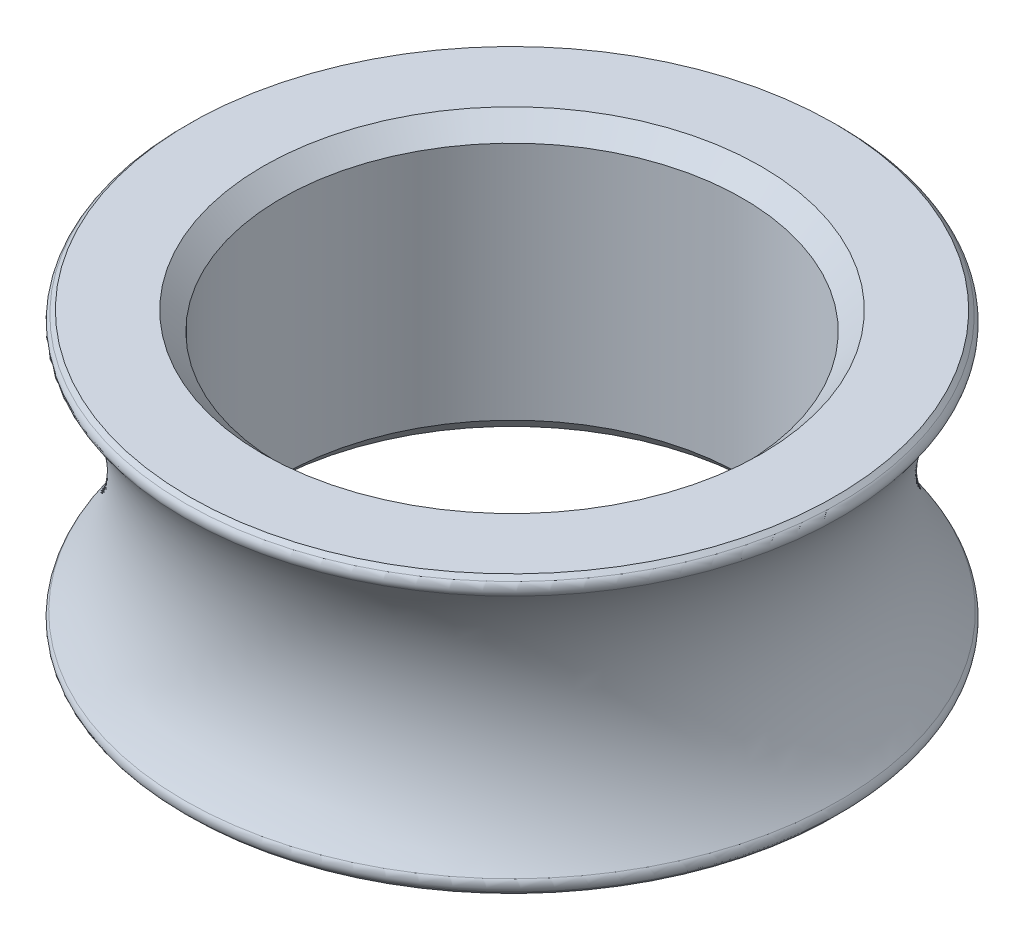
ISO-10303-21;
HEADER;
FILE_DESCRIPTION(('STEP AP214'),'2;1');
FILE_NAME('part.step','',(''),(''),'','','');
FILE_SCHEMA(('AUTOMOTIVE_DESIGN { 1 0 10303 214 1 1 1 1 }'));
ENDSEC;
DATA;
#1=APPLICATION_CONTEXT('core data for automotive mechanical design processes');
#2=APPLICATION_PROTOCOL_DEFINITION('international standard','automotive_design',2000,#1);
#3=PRODUCT_CONTEXT('',#1,'mechanical');
#4=PRODUCT('Part','Part','',(#3));
#5=PRODUCT_RELATED_PRODUCT_CATEGORY('part','',(#4));
#6=PRODUCT_DEFINITION_FORMATION('','',#4);
#7=PRODUCT_DEFINITION_CONTEXT('part definition',#1,'design');
#8=PRODUCT_DEFINITION('design','',#6,#7);
#9=PRODUCT_DEFINITION_SHAPE('','',#8);
#10=(LENGTH_UNIT() NAMED_UNIT(*) SI_UNIT(.MILLI.,.METRE.));
#11=(NAMED_UNIT(*) PLANE_ANGLE_UNIT() SI_UNIT($,.RADIAN.));
#12=(NAMED_UNIT(*) SI_UNIT($,.STERADIAN.) SOLID_ANGLE_UNIT());
#13=UNCERTAINTY_MEASURE_WITH_UNIT(LENGTH_MEASURE(1.E-05),#10,'distance_accuracy_value','');
#14=(GEOMETRIC_REPRESENTATION_CONTEXT(3) GLOBAL_UNCERTAINTY_ASSIGNED_CONTEXT((#13)) GLOBAL_UNIT_ASSIGNED_CONTEXT((#10,
#11,#12)) REPRESENTATION_CONTEXT('',''));
#15=CARTESIAN_POINT('',(0.,0.,0.));
#16=DIRECTION('',(0.,0.,1.));
#17=DIRECTION('',(1.,0.,0.));
#18=AXIS2_PLACEMENT_3D('',#15,#16,#17);
#19=CARTESIAN_POINT('',(0.,1.5,0.));
#20=DIRECTION('',(0.,1.,0.));
#21=DIRECTION('',(0.,0.,1.));
#22=AXIS2_PLACEMENT_3D('',#19,#20,#21);
#23=PLANE('',#22);
#24=CARTESIAN_POINT('',(0.,1.5,0.));
#25=DIRECTION('',(0.,1.,0.));
#26=DIRECTION('',(0.,0.,1.));
#27=AXIS2_PLACEMENT_3D('',#24,#25,#26);
#28=CIRCLE('',#27,3.5);
#29=CARTESIAN_POINT('',(0.,1.5,3.5));
#30=VERTEX_POINT('',#29);
#31=EDGE_CURVE('E85',#30,#30,#28,.T.);
#32=ORIENTED_EDGE('',*,*,#31,.T.);
#33=EDGE_LOOP('',(#32));
#34=FACE_BOUND('',#33,.T.);
#35=CARTESIAN_POINT('',(0.,1.5,0.));
#36=DIRECTION('',(0.,1.,0.));
#37=DIRECTION('',(0.,0.,1.));
#38=AXIS2_PLACEMENT_3D('',#35,#36,#37);
#39=CIRCLE('',#38,2.7);
#40=CARTESIAN_POINT('',(0.,1.5,2.7));
#41=VERTEX_POINT('',#40);
#42=EDGE_CURVE('E83',#41,#41,#39,.F.);
#43=ORIENTED_EDGE('',*,*,#42,.T.);
#44=EDGE_LOOP('',(#43));
#45=FACE_BOUND('',#44,.T.);
#46=ADVANCED_FACE('F35',(#34,#45),#23,.T.);
#47=CARTESIAN_POINT('',(0.,-1.5,0.));
#48=DIRECTION('',(0.,1.,0.));
#49=DIRECTION('',(0.,0.,1.));
#50=AXIS2_PLACEMENT_3D('',#47,#48,#49);
#51=PLANE('',#50);
#52=CARTESIAN_POINT('',(0.,-1.5,0.));
#53=DIRECTION('',(0.,1.,0.));
#54=DIRECTION('',(0.,0.,1.));
#55=AXIS2_PLACEMENT_3D('',#52,#53,#54);
#56=CIRCLE('',#55,2.7);
#57=CARTESIAN_POINT('',(0.,-1.5,2.7));
#58=VERTEX_POINT('',#57);
#59=EDGE_CURVE('E94',#58,#58,#56,.T.);
#60=ORIENTED_EDGE('',*,*,#59,.T.);
#61=EDGE_LOOP('',(#60));
#62=FACE_BOUND('',#61,.T.);
#63=CARTESIAN_POINT('',(0.,-1.5,0.));
#64=DIRECTION('',(0.,1.,0.));
#65=DIRECTION('',(0.,0.,1.));
#66=AXIS2_PLACEMENT_3D('',#63,#64,#65);
#67=CIRCLE('',#66,3.5);
#68=CARTESIAN_POINT('',(0.,-1.5,3.5));
#69=VERTEX_POINT('',#68);
#70=EDGE_CURVE('E74',#69,#69,#67,.F.);
#71=ORIENTED_EDGE('',*,*,#70,.T.);
#72=EDGE_LOOP('',(#71));
#73=FACE_BOUND('',#72,.T.);
#74=ADVANCED_FACE('F117',(#62,#73),#51,.F.);
#75=CARTESIAN_POINT('',(0.,1.5,0.));
#76=DIRECTION('',(0.,-1.,0.));
#77=DIRECTION('',(0.,0.,-1.));
#78=AXIS2_PLACEMENT_3D('',#75,#76,#77);
#79=CYLINDRICAL_SURFACE('',#78,2.5);
#80=CARTESIAN_POINT('',(0.,-1.3,0.));
#81=DIRECTION('',(0.,1.,0.));
#82=DIRECTION('',(0.,0.,1.));
#83=AXIS2_PLACEMENT_3D('',#80,#81,#82);
#84=CIRCLE('',#83,2.5);
#85=CARTESIAN_POINT('',(0.,-1.3,2.5));
#86=VERTEX_POINT('',#85);
#87=EDGE_CURVE('E99',#86,#86,#84,.F.);
#88=ORIENTED_EDGE('',*,*,#87,.T.);
#89=EDGE_LOOP('',(#88));
#90=FACE_BOUND('',#89,.T.);
#91=CARTESIAN_POINT('',(0.,1.3,0.));
#92=DIRECTION('',(0.,1.,0.));
#93=DIRECTION('',(0.,0.,1.));
#94=AXIS2_PLACEMENT_3D('',#91,#92,#93);
#95=CIRCLE('',#94,2.5);
#96=CARTESIAN_POINT('',(0.,1.3,2.5));
#97=VERTEX_POINT('',#96);
#98=EDGE_CURVE('E97',#97,#97,#95,.T.);
#99=ORIENTED_EDGE('',*,*,#98,.T.);
#100=EDGE_LOOP('',(#99));
#101=FACE_BOUND('',#100,.T.);
#102=ADVANCED_FACE('F114',(#90,#101),#79,.F.);
#103=CARTESIAN_POINT('',(0.,0.,0.));
#104=DIRECTION('',(0.,1.,0.));
#105=DIRECTION('',(0.,0.,1.));
#106=AXIS2_PLACEMENT_3D('',#103,#104,#105);
#107=TOROIDAL_SURFACE('',#106,5.275,2.175);
#108=CARTESIAN_POINT('',(0.,0.,5.275));
#109=DIRECTION('',(1.,0.,0.));
#110=DIRECTION('',(0.,0.,1.));
#111=AXIS2_PLACEMENT_3D('',#108,#109,#110);
#112=CIRCLE('',#111,2.175);
#113=CARTESIAN_POINT('',(0.,-1.3259621573394,3.55092072186229));
#114=VERTEX_POINT('',#113);
#115=CARTESIAN_POINT('',(0.,1.3259621573394,3.55092072186229));
#116=VERTEX_POINT('',#115);
#117=EDGE_CURVE('E75',#114,#116,#112,.T.);
#118=ORIENTED_EDGE('',*,*,#117,.T.);
#119=CARTESIAN_POINT('',(0.,1.3259621573394,0.));
#120=DIRECTION('',(0.,-1.,0.));
#121=DIRECTION('',(0.,0.,-1.));
#122=AXIS2_PLACEMENT_3D('',#119,#120,#121);
#123=CIRCLE('',#122,3.55092072186229);
#124=EDGE_CURVE('E203',#116,#116,#123,.T.);
#125=ORIENTED_EDGE('',*,*,#124,.T.);
#126=ORIENTED_EDGE('',*,*,#117,.F.);
#127=CARTESIAN_POINT('',(0.,-1.3259621573394,0.));
#128=DIRECTION('',(0.,1.,0.));
#129=DIRECTION('',(0.,0.,1.));
#130=AXIS2_PLACEMENT_3D('',#127,#128,#129);
#131=CIRCLE('',#130,3.55092072186229);
#132=EDGE_CURVE('E87',#114,#114,#131,.T.);
#133=ORIENTED_EDGE('',*,*,#132,.T.);
#134=EDGE_LOOP('',(#118,#125,#126,#133));
#135=FACE_BOUND('',#134,.T.);
#136=ADVANCED_FACE('F116',(#135),#107,.F.);
#137=CARTESIAN_POINT('',(0.,-1.5,0.));
#138=DIRECTION('',(0.,-1.,0.));
#139=DIRECTION('',(0.,0.,-1.));
#140=AXIS2_PLACEMENT_3D('',#137,#138,#139);
#141=CONICAL_SURFACE('',#140,2.7,0.785398163397447);
#142=ORIENTED_EDGE('',*,*,#87,.F.);
#143=EDGE_LOOP('',(#142));
#144=FACE_BOUND('',#143,.T.);
#145=ORIENTED_EDGE('',*,*,#59,.F.);
#146=EDGE_LOOP('',(#145));
#147=FACE_BOUND('',#146,.T.);
#148=ADVANCED_FACE('F110',(#144,#147),#141,.F.);
#149=CARTESIAN_POINT('',(0.,1.3,0.));
#150=DIRECTION('',(0.,1.,0.));
#151=DIRECTION('',(0.,0.,1.));
#152=AXIS2_PLACEMENT_3D('',#149,#150,#151);
#153=CONICAL_SURFACE('',#152,2.5,0.785398163397448);
#154=CARTESIAN_POINT('',(0.,1.5,2.7));
#155=CARTESIAN_POINT('',(0.,1.49791666666667,2.69791666666667));
#156=CARTESIAN_POINT('',(0.,1.49583333333333,2.69583333333333));
#157=CARTESIAN_POINT('',(0.,1.49166666666667,2.69166666666667));
#158=CARTESIAN_POINT('',(0.,1.48958333333333,2.68958333333333));
#159=CARTESIAN_POINT('',(0.,1.48541666666667,2.68541666666667));
#160=CARTESIAN_POINT('',(0.,1.48333333333333,2.68333333333333));
#161=CARTESIAN_POINT('',(0.,1.47916666666667,2.67916666666667));
#162=CARTESIAN_POINT('',(0.,1.47708333333333,2.67708333333333));
#163=CARTESIAN_POINT('',(0.,1.47291666666667,2.67291666666667));
#164=CARTESIAN_POINT('',(0.,1.47083333333333,2.67083333333333));
#165=CARTESIAN_POINT('',(0.,1.46666666666667,2.66666666666667));
#166=CARTESIAN_POINT('',(0.,1.46458333333333,2.66458333333333));
#167=CARTESIAN_POINT('',(0.,1.46041666666667,2.66041666666667));
#168=CARTESIAN_POINT('',(0.,1.45833333333333,2.65833333333333));
#169=CARTESIAN_POINT('',(0.,1.45416666666667,2.65416666666667));
#170=CARTESIAN_POINT('',(0.,1.45208333333333,2.65208333333333));
#171=CARTESIAN_POINT('',(0.,1.44791666666667,2.64791666666667));
#172=CARTESIAN_POINT('',(0.,1.44583333333333,2.64583333333333));
#173=CARTESIAN_POINT('',(0.,1.44166666666667,2.64166666666667));
#174=CARTESIAN_POINT('',(0.,1.43958333333333,2.63958333333333));
#175=CARTESIAN_POINT('',(0.,1.43541666666667,2.63541666666667));
#176=CARTESIAN_POINT('',(0.,1.43333333333333,2.63333333333333));
#177=CARTESIAN_POINT('',(0.,1.42916666666667,2.62916666666667));
#178=CARTESIAN_POINT('',(0.,1.42708333333333,2.62708333333333));
#179=CARTESIAN_POINT('',(0.,1.42291666666667,2.62291666666667));
#180=CARTESIAN_POINT('',(0.,1.42083333333333,2.62083333333333));
#181=CARTESIAN_POINT('',(0.,1.41666666666667,2.61666666666667));
#182=CARTESIAN_POINT('',(0.,1.41458333333333,2.61458333333333));
#183=CARTESIAN_POINT('',(0.,1.41041666666667,2.61041666666667));
#184=CARTESIAN_POINT('',(0.,1.40833333333333,2.60833333333333));
#185=CARTESIAN_POINT('',(0.,1.40416666666667,2.60416666666667));
#186=CARTESIAN_POINT('',(0.,1.40208333333333,2.60208333333333));
#187=CARTESIAN_POINT('',(0.,1.39791666666667,2.59791666666667));
#188=CARTESIAN_POINT('',(0.,1.39583333333333,2.59583333333333));
#189=CARTESIAN_POINT('',(0.,1.39166666666667,2.59166666666667));
#190=CARTESIAN_POINT('',(0.,1.38958333333333,2.58958333333333));
#191=CARTESIAN_POINT('',(0.,1.38541666666667,2.58541666666667));
#192=CARTESIAN_POINT('',(0.,1.38333333333333,2.58333333333333));
#193=CARTESIAN_POINT('',(0.,1.37916666666667,2.57916666666667));
#194=CARTESIAN_POINT('',(0.,1.37708333333333,2.57708333333333));
#195=CARTESIAN_POINT('',(0.,1.37291666666667,2.57291666666667));
#196=CARTESIAN_POINT('',(0.,1.37083333333333,2.57083333333333));
#197=CARTESIAN_POINT('',(0.,1.36666666666667,2.56666666666667));
#198=CARTESIAN_POINT('',(0.,1.36458333333333,2.56458333333333));
#199=CARTESIAN_POINT('',(0.,1.36041666666667,2.56041666666667));
#200=CARTESIAN_POINT('',(0.,1.35833333333333,2.55833333333333));
#201=CARTESIAN_POINT('',(0.,1.35416666666667,2.55416666666667));
#202=CARTESIAN_POINT('',(0.,1.35208333333333,2.55208333333333));
#203=CARTESIAN_POINT('',(0.,1.34791666666667,2.54791666666667));
#204=CARTESIAN_POINT('',(0.,1.34583333333333,2.54583333333333));
#205=CARTESIAN_POINT('',(0.,1.34166666666667,2.54166666666667));
#206=CARTESIAN_POINT('',(0.,1.33958333333333,2.53958333333333));
#207=CARTESIAN_POINT('',(0.,1.33541666666667,2.53541666666667));
#208=CARTESIAN_POINT('',(0.,1.33333333333333,2.53333333333333));
#209=CARTESIAN_POINT('',(0.,1.32916666666667,2.52916666666667));
#210=CARTESIAN_POINT('',(0.,1.32708333333333,2.52708333333333));
#211=CARTESIAN_POINT('',(0.,1.32291666666667,2.52291666666667));
#212=CARTESIAN_POINT('',(0.,1.32083333333333,2.52083333333333));
#213=CARTESIAN_POINT('',(0.,1.31666666666667,2.51666666666667));
#214=CARTESIAN_POINT('',(0.,1.31458333333333,2.51458333333333));
#215=CARTESIAN_POINT('',(0.,1.31041666666667,2.51041666666667));
#216=CARTESIAN_POINT('',(0.,1.30833333333333,2.50833333333333));
#217=CARTESIAN_POINT('',(0.,1.30416666666667,2.50416666666667));
#218=CARTESIAN_POINT('',(0.,1.30208333333333,2.50208333333333));
#219=CARTESIAN_POINT('',(0.,1.3,2.5));
#220=B_SPLINE_CURVE_WITH_KNOTS('',3,(#154,#155,#156,#157,#158,#159,#160,#161,#162,#163,#164,
#165,#166,#167,#168,#169,#170,#171,#172,#173,#174,#175,#176,#177,#178,#179,#180,#181,#182,#183,
#184,#185,#186,#187,#188,#189,#190,#191,#192,#193,#194,#195,#196,#197,#198,#199,#200,#201,#202,
#203,#204,#205,#206,#207,#208,#209,#210,#211,#212,#213,#214,#215,#216,#217,#218,#219),
.UNSPECIFIED.,.F.,.F.,(4,2,2,2,2,2,2,2,2,2,2,2,2,2,2,2,2,2,2,2,2,2,2,2,2,2,2,2,2,2,2,2,4),(0.,
0.00883883476483194,0.0176776695296636,0.0265165042944955,0.0353553390593272,0.0441941738241591,
0.0530330085889908,0.0618718433538227,0.0707106781186543,0.0795495128834863,0.0883883476483182,
0.0972271824131498,0.106066017177982,0.114904851942813,0.123743686707645,0.132582521472477,
0.141421356237309,0.150260191002141,0.159099025766973,0.167937860531804,0.176776695296636,
0.185615530061468,0.1944543648263,0.203293199591132,0.212132034355963,0.220970869120795,
0.229809703885627,0.238648538650459,0.247487373415291,0.256326208180123,0.265165042944954,
0.274003877709786,0.282842712474618),.UNSPECIFIED.);
#221=EDGE_CURVE('BSEAM107',#41,#97,#220,.T.);
#222=ORIENTED_EDGE('',*,*,#42,.F.);
#223=ORIENTED_EDGE('',*,*,#98,.F.);
#224=ORIENTED_EDGE('',*,*,#221,.T.);
#225=ORIENTED_EDGE('',*,*,#221,.F.);
#226=EDGE_LOOP('',(#222,#224,#223,#225));
#227=FACE_BOUND('',#226,.T.);
#228=ADVANCED_FACE('F107',(#227),#153,.F.);
#229=CARTESIAN_POINT('',(0.,-1.39429837119642,0.));
#230=DIRECTION('',(0.,1.,0.));
#231=DIRECTION('',(0.,0.,1.));
#232=AXIS2_PLACEMENT_3D('',#229,#230,#231);
#233=CONICAL_SURFACE('',#232,3.60570162880358,0.785398163397452);
#234=DIRECTION('',(0.,0.707106781186545,0.70710678118655));
#235=VECTOR('',#234,1.);
#236=CARTESIAN_POINT('',(0.,-1.5,3.5));
#237=LINE('',#236,#235);
#238=CARTESIAN_POINT('',(0.,-1.457636612807,3.54236338719301));
#239=VERTEX_POINT('',#238);
#240=EDGE_CURVE('E71',#69,#239,#237,.T.);
#241=ORIENTED_EDGE('',*,*,#240,.T.);
#242=CARTESIAN_POINT('',(0.,-1.457636612807,0.));
#243=DIRECTION('',(0.,1.,0.));
#244=DIRECTION('',(0.,0.,1.));
#245=AXIS2_PLACEMENT_3D('',#242,#243,#244);
#246=CIRCLE('',#245,3.54236338719301);
#247=EDGE_CURVE('E11',#239,#239,#246,.F.);
#248=ORIENTED_EDGE('',*,*,#247,.T.);
#249=ORIENTED_EDGE('',*,*,#240,.F.);
#250=ORIENTED_EDGE('',*,*,#70,.F.);
#251=EDGE_LOOP('',(#241,#248,#249,#250));
#252=FACE_BOUND('',#251,.T.);
#253=ADVANCED_FACE('F72',(#252),#233,.T.);
#254=CARTESIAN_POINT('',(0.,1.5,0.));
#255=DIRECTION('',(0.,-1.,0.));
#256=DIRECTION('',(0.,0.,-1.));
#257=AXIS2_PLACEMENT_3D('',#254,#255,#256);
#258=CONICAL_SURFACE('',#257,3.5,0.785398163397446);
#259=DIRECTION('',(0.,0.70710678118655,-0.707106781186545));
#260=VECTOR('',#259,1.);
#261=CARTESIAN_POINT('',(0.,1.39429837119642,3.60570162880358));
#262=LINE('',#261,#260);
#263=CARTESIAN_POINT('',(0.,1.45763661280699,3.54236338719301));
#264=VERTEX_POINT('',#263);
#265=EDGE_CURVE('E76',#264,#30,#262,.T.);
#266=ORIENTED_EDGE('',*,*,#265,.F.);
#267=CARTESIAN_POINT('',(0.,1.45763661280699,0.));
#268=DIRECTION('',(0.,-1.,0.));
#269=DIRECTION('',(0.,0.,-1.));
#270=AXIS2_PLACEMENT_3D('',#267,#268,#269);
#271=CIRCLE('',#270,3.54236338719301);
#272=EDGE_CURVE('E44',#264,#264,#271,.F.);
#273=ORIENTED_EDGE('',*,*,#272,.T.);
#274=ORIENTED_EDGE('',*,*,#265,.T.);
#275=ORIENTED_EDGE('',*,*,#31,.F.);
#276=EDGE_LOOP('',(#266,#273,#274,#275));
#277=FACE_BOUND('',#276,.T.);
#278=ADVANCED_FACE('F138',(#277),#258,.T.);
#279=CARTESIAN_POINT('',(0.,1.38692593468834,0.));
#280=DIRECTION('',(0.,1.,0.));
#281=DIRECTION('',(0.,0.,1.));
#282=AXIS2_PLACEMENT_3D('',#279,#280,#281);
#283=TOROIDAL_SURFACE('',#282,3.47165270907435,0.1);
#284=CARTESIAN_POINT('',(0.,1.38692593468834,3.47165270907435));
#285=DIRECTION('',(1.,0.,0.));
#286=DIRECTION('',(0.,0.,-1.));
#287=AXIS2_PLACEMENT_3D('',#284,#285,#286);
#288=CIRCLE('',#287,0.1);
#289=EDGE_CURVE('E58',#264,#116,#288,.T.);
#290=ORIENTED_EDGE('',*,*,#289,.F.);
#291=ORIENTED_EDGE('',*,*,#272,.F.);
#292=ORIENTED_EDGE('',*,*,#289,.T.);
#293=ORIENTED_EDGE('',*,*,#124,.F.);
#294=EDGE_LOOP('',(#290,#291,#292,#293));
#295=FACE_BOUND('',#294,.T.);
#296=ADVANCED_FACE('F140',(#295),#283,.T.);
#297=CARTESIAN_POINT('',(0.,-1.38692593468834,0.));
#298=DIRECTION('',(0.,-1.,0.));
#299=DIRECTION('',(0.,0.,-1.));
#300=AXIS2_PLACEMENT_3D('',#297,#298,#299);
#301=TOROIDAL_SURFACE('',#300,3.47165270907435,0.1);
#302=CARTESIAN_POINT('',(0.,-1.38692593468834,3.47165270907435));
#303=DIRECTION('',(-1.,0.,0.));
#304=DIRECTION('',(0.,0.,1.));
#305=AXIS2_PLACEMENT_3D('',#302,#303,#304);
#306=CIRCLE('',#305,0.1);
#307=EDGE_CURVE('E39',#239,#114,#306,.T.);
#308=ORIENTED_EDGE('',*,*,#307,.F.);
#309=ORIENTED_EDGE('',*,*,#247,.F.);
#310=ORIENTED_EDGE('',*,*,#307,.T.);
#311=ORIENTED_EDGE('',*,*,#132,.F.);
#312=EDGE_LOOP('',(#308,#309,#310,#311));
#313=FACE_BOUND('',#312,.T.);
#314=ADVANCED_FACE('F37',(#313),#301,.T.);
#315=CLOSED_SHELL('',(#46,#74,#102,#136,#148,#228,#253,#278,#296,#314));
#316=MANIFOLD_SOLID_BREP('B2',#315);
#317=ADVANCED_BREP_SHAPE_REPRESENTATION('',(#18,#316),#14);
#318=SHAPE_DEFINITION_REPRESENTATION(#9,#317);
ENDSEC;
END-ISO-10303-21;
